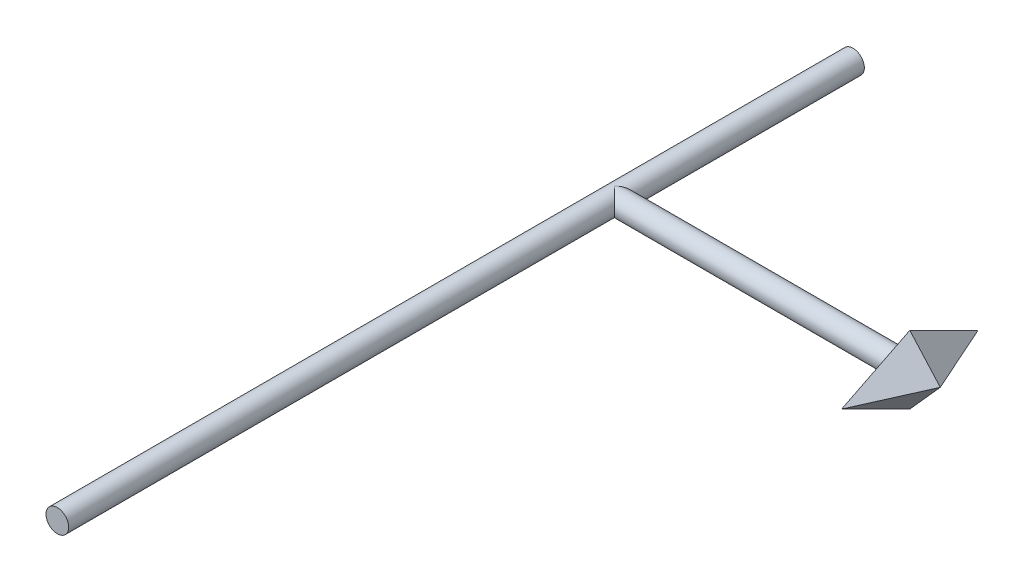
ISO-10303-21;
HEADER;
FILE_DESCRIPTION(('STEP AP214'),'2;1');
FILE_NAME('part.step','',(''),(''),'','','');
FILE_SCHEMA(('AUTOMOTIVE_DESIGN { 1 0 10303 214 1 1 1 1 }'));
ENDSEC;
DATA;
#1=APPLICATION_CONTEXT('core data for automotive mechanical design processes');
#2=APPLICATION_PROTOCOL_DEFINITION('international standard','automotive_design',2000,#1);
#3=PRODUCT_CONTEXT('',#1,'mechanical');
#4=PRODUCT('Part','Part','',(#3));
#5=PRODUCT_RELATED_PRODUCT_CATEGORY('part','',(#4));
#6=PRODUCT_DEFINITION_FORMATION('','',#4);
#7=PRODUCT_DEFINITION_CONTEXT('part definition',#1,'design');
#8=PRODUCT_DEFINITION('design','',#6,#7);
#9=PRODUCT_DEFINITION_SHAPE('','',#8);
#10=(LENGTH_UNIT() NAMED_UNIT(*) SI_UNIT(.MILLI.,.METRE.));
#11=(NAMED_UNIT(*) PLANE_ANGLE_UNIT() SI_UNIT($,.RADIAN.));
#12=(NAMED_UNIT(*) SI_UNIT($,.STERADIAN.) SOLID_ANGLE_UNIT());
#13=UNCERTAINTY_MEASURE_WITH_UNIT(LENGTH_MEASURE(1.E-05),#10,'distance_accuracy_value','');
#14=(GEOMETRIC_REPRESENTATION_CONTEXT(3) GLOBAL_UNCERTAINTY_ASSIGNED_CONTEXT((#13)) GLOBAL_UNIT_ASSIGNED_CONTEXT((#10,
#11,#12)) REPRESENTATION_CONTEXT('',''));
#15=CARTESIAN_POINT('',(0.,0.,0.));
#16=DIRECTION('',(0.,0.,1.));
#17=DIRECTION('',(1.,0.,0.));
#18=AXIS2_PLACEMENT_3D('',#15,#16,#17);
#19=CARTESIAN_POINT('',(0.,0.,600.));
#20=DIRECTION('',(0.,0.,-1.));
#21=DIRECTION('',(-1.,0.,0.));
#22=AXIS2_PLACEMENT_3D('',#19,#20,#21);
#23=CYLINDRICAL_SURFACE('',#22,5.);
#24=CARTESIAN_POINT('',(0.,0.,250.));
#25=DIRECTION('',(0.,0.,1.));
#26=DIRECTION('',(1.,0.,0.));
#27=AXIS2_PLACEMENT_3D('',#24,#25,#26);
#28=CIRCLE('',#27,5.);
#29=CARTESIAN_POINT('',(5.,0.,250.));
#30=VERTEX_POINT('',#29);
#31=EDGE_CURVE('E47',#30,#30,#28,.T.);
#32=ORIENTED_EDGE('',*,*,#31,.T.);
#33=EDGE_LOOP('',(#32));
#34=FACE_BOUND('',#33,.T.);
#35=CARTESIAN_POINT('',(0.,0.,600.));
#36=DIRECTION('',(0.,0.,1.));
#37=DIRECTION('',(1.,0.,0.));
#38=AXIS2_PLACEMENT_3D('',#35,#36,#37);
#39=CIRCLE('',#38,5.);
#40=CARTESIAN_POINT('',(5.,0.,600.));
#41=VERTEX_POINT('',#40);
#42=EDGE_CURVE('E122',#41,#41,#39,.T.);
#43=ORIENTED_EDGE('',*,*,#42,.F.);
#44=EDGE_LOOP('',(#43));
#45=FACE_BOUND('',#44,.T.);
#46=CARTESIAN_POINT('',(0.,0.,355.));
#47=DIRECTION('',(-0.707106781186547,0.,-0.707106781186547));
#48=DIRECTION('',(0.707106781186547,0.,-0.707106781186547));
#49=AXIS2_PLACEMENT_3D('',#46,#47,#48);
#50=ELLIPSE('',#49,7.07106781186547,4.99999999999999);
#51=CARTESIAN_POINT('',(0.,-5.,355.));
#52=VERTEX_POINT('',#51);
#53=CARTESIAN_POINT('',(0.,5.,355.));
#54=VERTEX_POINT('',#53);
#55=EDGE_CURVE('E11',#52,#54,#50,.F.);
#56=ORIENTED_EDGE('',*,*,#55,.F.);
#57=CARTESIAN_POINT('',(0.,0.,355.));
#58=DIRECTION('',(0.707106781186547,0.,-0.707106781186547));
#59=DIRECTION('',(-0.707106781186547,0.,-0.707106781186547));
#60=AXIS2_PLACEMENT_3D('',#57,#58,#59);
#61=ELLIPSE('',#60,7.07106781186547,4.99999999999999);
#62=EDGE_CURVE('E53',#54,#52,#61,.T.);
#63=ORIENTED_EDGE('',*,*,#62,.F.);
#64=EDGE_LOOP('',(#56,#63));
#65=FACE_BOUND('',#64,.T.);
#66=ADVANCED_FACE('F44',(#34,#45,#65),#23,.T.);
#67=CARTESIAN_POINT('',(0.,0.,600.));
#68=DIRECTION('',(0.,0.,1.));
#69=DIRECTION('',(1.,0.,0.));
#70=AXIS2_PLACEMENT_3D('',#67,#68,#69);
#71=PLANE('',#70);
#72=ORIENTED_EDGE('',*,*,#42,.T.);
#73=EDGE_LOOP('',(#72));
#74=FACE_BOUND('',#73,.T.);
#75=ADVANCED_FACE('F130',(#74),#71,.T.);
#76=CARTESIAN_POINT('',(130.,0.,355.));
#77=DIRECTION('',(-1.,0.,0.));
#78=DIRECTION('',(0.,0.,1.));
#79=AXIS2_PLACEMENT_3D('',#76,#77,#78);
#80=CYLINDRICAL_SURFACE('',#79,4.99999999999999);
#81=CARTESIAN_POINT('',(130.,0.,355.));
#82=DIRECTION('',(1.,0.,0.));
#83=DIRECTION('',(0.,0.,-1.));
#84=AXIS2_PLACEMENT_3D('',#81,#82,#83);
#85=CIRCLE('',#84,4.99999999999999);
#86=CARTESIAN_POINT('',(130.,0.,350.));
#87=VERTEX_POINT('',#86);
#88=EDGE_CURVE('E96',#87,#87,#85,.T.);
#89=ORIENTED_EDGE('',*,*,#88,.F.);
#90=EDGE_LOOP('',(#89));
#91=FACE_BOUND('',#90,.T.);
#92=ORIENTED_EDGE('',*,*,#62,.T.);
#93=ORIENTED_EDGE('',*,*,#55,.T.);
#94=EDGE_LOOP('',(#92,#93));
#95=FACE_BOUND('',#94,.T.);
#96=ADVANCED_FACE('F128',(#91,#95),#80,.T.);
#97=CARTESIAN_POINT('',(130.,15.,355.));
#98=DIRECTION('',(0.707106781186549,0.632455532033675,-0.316227766016837));
#99=DIRECTION('',(-0.666666666666665,0.745355992499931,0.));
#100=AXIS2_PLACEMENT_3D('',#97,#98,#99);
#101=PLANE('',#100);
#102=DIRECTION('',(0.,0.447213595499957,0.894427190999916));
#103=VECTOR('',#102,1.);
#104=CARTESIAN_POINT('',(130.,15.,355.));
#105=LINE('',#104,#103);
#106=CARTESIAN_POINT('',(130.,0.,325.));
#107=VERTEX_POINT('',#106);
#108=CARTESIAN_POINT('',(130.,15.,355.));
#109=VERTEX_POINT('',#108);
#110=EDGE_CURVE('E83',#107,#109,#105,.T.);
#111=ORIENTED_EDGE('',*,*,#110,.T.);
#112=DIRECTION('',(-0.666666666666665,0.745355992499931,0.));
#113=VECTOR('',#112,1.);
#114=CARTESIAN_POINT('',(130.,15.,355.));
#115=LINE('',#114,#113);
#116=CARTESIAN_POINT('',(143.416407864999,0.,355.));
#117=VERTEX_POINT('',#116);
#118=EDGE_CURVE('E90',#117,#109,#115,.T.);
#119=ORIENTED_EDGE('',*,*,#118,.F.);
#120=DIRECTION('',(-0.408248290463862,0.,-0.912870929175278));
#121=VECTOR('',#120,1.);
#122=CARTESIAN_POINT('',(141.180339887499,0.,350.));
#123=LINE('',#122,#121);
#124=EDGE_CURVE('E100',#117,#107,#123,.T.);
#125=ORIENTED_EDGE('',*,*,#124,.T.);
#126=EDGE_LOOP('',(#111,#119,#125));
#127=FACE_BOUND('',#126,.T.);
#128=ADVANCED_FACE('F98',(#127),#101,.T.);
#129=CARTESIAN_POINT('',(130.,15.,355.));
#130=DIRECTION('',(0.707106781186549,0.632455532033675,0.316227766016837));
#131=DIRECTION('',(-0.666666666666665,0.745355992499931,0.));
#132=AXIS2_PLACEMENT_3D('',#129,#130,#131);
#133=PLANE('',#132);
#134=DIRECTION('',(0.,-0.447213595499958,0.894427190999916));
#135=VECTOR('',#134,1.);
#136=CARTESIAN_POINT('',(130.,15.,355.));
#137=LINE('',#136,#135);
#138=CARTESIAN_POINT('',(130.,0.,385.));
#139=VERTEX_POINT('',#138);
#140=EDGE_CURVE('E78',#109,#139,#137,.T.);
#141=ORIENTED_EDGE('',*,*,#140,.T.);
#142=DIRECTION('',(-0.408248290463862,0.,0.912870929175277));
#143=VECTOR('',#142,1.);
#144=CARTESIAN_POINT('',(130.,0.,385.));
#145=LINE('',#144,#143);
#146=EDGE_CURVE('E92',#117,#139,#145,.T.);
#147=ORIENTED_EDGE('',*,*,#146,.F.);
#148=ORIENTED_EDGE('',*,*,#118,.T.);
#149=EDGE_LOOP('',(#141,#147,#148));
#150=FACE_BOUND('',#149,.T.);
#151=ADVANCED_FACE('F91',(#150),#133,.T.);
#152=CARTESIAN_POINT('',(130.,0.,385.));
#153=DIRECTION('',(0.707106781186549,-0.632455532033675,0.316227766016837));
#154=DIRECTION('',(0.666666666666665,0.745355992499931,0.));
#155=AXIS2_PLACEMENT_3D('',#152,#153,#154);
#156=PLANE('',#155);
#157=DIRECTION('',(0.,-0.447213595499958,-0.894427190999916));
#158=VECTOR('',#157,1.);
#159=CARTESIAN_POINT('',(130.,0.,385.));
#160=LINE('',#159,#158);
#161=CARTESIAN_POINT('',(130.,-15.,355.));
#162=VERTEX_POINT('',#161);
#163=EDGE_CURVE('E85',#139,#162,#160,.T.);
#164=ORIENTED_EDGE('',*,*,#163,.T.);
#165=DIRECTION('',(-0.666666666666666,-0.745355992499931,0.));
#166=VECTOR('',#165,1.);
#167=CARTESIAN_POINT('',(137.453559924999,-6.66666666666664,355.));
#168=LINE('',#167,#166);
#169=EDGE_CURVE('E114',#117,#162,#168,.T.);
#170=ORIENTED_EDGE('',*,*,#169,.F.);
#171=ORIENTED_EDGE('',*,*,#146,.T.);
#172=EDGE_LOOP('',(#164,#170,#171));
#173=FACE_BOUND('',#172,.T.);
#174=ADVANCED_FACE('F161',(#173),#156,.T.);
#175=CARTESIAN_POINT('',(130.,0.,325.));
#176=DIRECTION('',(0.707106781186549,-0.632455532033675,-0.316227766016837));
#177=DIRECTION('',(0.666666666666665,0.745355992499931,0.));
#178=AXIS2_PLACEMENT_3D('',#175,#176,#177);
#179=PLANE('',#178);
#180=DIRECTION('',(0.,0.447213595499958,-0.894427190999916));
#181=VECTOR('',#180,1.);
#182=CARTESIAN_POINT('',(130.,0.,325.));
#183=LINE('',#182,#181);
#184=EDGE_CURVE('E109',#162,#107,#183,.T.);
#185=ORIENTED_EDGE('',*,*,#184,.T.);
#186=ORIENTED_EDGE('',*,*,#124,.F.);
#187=ORIENTED_EDGE('',*,*,#169,.T.);
#188=EDGE_LOOP('',(#185,#186,#187));
#189=FACE_BOUND('',#188,.T.);
#190=ADVANCED_FACE('F155',(#189),#179,.T.);
#191=CARTESIAN_POINT('',(130.,0.,0.));
#192=DIRECTION('',(-1.,0.,0.));
#193=DIRECTION('',(0.,0.,1.));
#194=AXIS2_PLACEMENT_3D('',#191,#192,#193);
#195=PLANE('',#194);
#196=ORIENTED_EDGE('',*,*,#88,.T.);
#197=EDGE_LOOP('',(#196));
#198=FACE_BOUND('',#197,.T.);
#199=ORIENTED_EDGE('',*,*,#110,.F.);
#200=ORIENTED_EDGE('',*,*,#184,.F.);
#201=ORIENTED_EDGE('',*,*,#163,.F.);
#202=ORIENTED_EDGE('',*,*,#140,.F.);
#203=EDGE_LOOP('',(#199,#200,#201,#202));
#204=FACE_BOUND('',#203,.T.);
#205=ADVANCED_FACE('F80',(#198,#204),#195,.T.);
#206=CARTESIAN_POINT('',(-354.614475583012,-250.,250.));
#207=DIRECTION('',(0.,0.,1.));
#208=DIRECTION('',(1.,0.,0.));
#209=AXIS2_PLACEMENT_3D('',#206,#207,#208);
#210=PLANE('',#209);
#211=ORIENTED_EDGE('',*,*,#31,.F.);
#212=EDGE_LOOP('',(#211));
#213=FACE_BOUND('',#212,.T.);
#214=ADVANCED_FACE('F151',(#213),#210,.F.);
#215=CLOSED_SHELL('',(#66,#75,#96,#128,#151,#174,#190,#205,#214));
#216=MANIFOLD_SOLID_BREP('B2',#215);
#217=ADVANCED_BREP_SHAPE_REPRESENTATION('',(#18,#216),#14);
#218=SHAPE_DEFINITION_REPRESENTATION(#9,#217);
ENDSEC;
END-ISO-10303-21;
